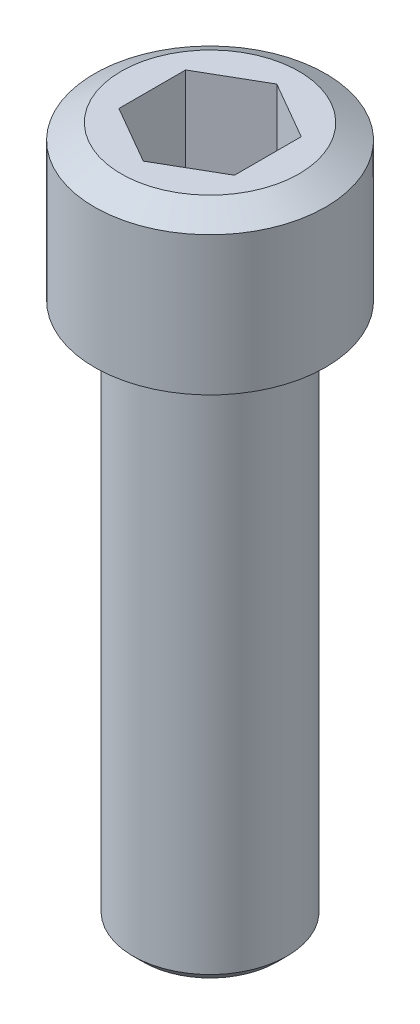
ISO-10303-21;
HEADER;
FILE_DESCRIPTION(('STEP AP214'),'2;1');
FILE_NAME('part.step','',(''),(''),'','','');
FILE_SCHEMA(('AUTOMOTIVE_DESIGN { 1 0 10303 214 1 1 1 1 }'));
ENDSEC;
DATA;
#1=APPLICATION_CONTEXT('core data for automotive mechanical design processes');
#2=APPLICATION_PROTOCOL_DEFINITION('international standard','automotive_design',2000,#1);
#3=PRODUCT_CONTEXT('',#1,'mechanical');
#4=PRODUCT('Part','Part','',(#3));
#5=PRODUCT_RELATED_PRODUCT_CATEGORY('part','',(#4));
#6=PRODUCT_DEFINITION_FORMATION('','',#4);
#7=PRODUCT_DEFINITION_CONTEXT('part definition',#1,'design');
#8=PRODUCT_DEFINITION('design','',#6,#7);
#9=PRODUCT_DEFINITION_SHAPE('','',#8);
#10=(LENGTH_UNIT() NAMED_UNIT(*) SI_UNIT(.MILLI.,.METRE.));
#11=(NAMED_UNIT(*) PLANE_ANGLE_UNIT() SI_UNIT($,.RADIAN.));
#12=(NAMED_UNIT(*) SI_UNIT($,.STERADIAN.) SOLID_ANGLE_UNIT());
#13=UNCERTAINTY_MEASURE_WITH_UNIT(LENGTH_MEASURE(1.E-05),#10,'distance_accuracy_value','');
#14=(GEOMETRIC_REPRESENTATION_CONTEXT(3) GLOBAL_UNCERTAINTY_ASSIGNED_CONTEXT((#13)) GLOBAL_UNIT_ASSIGNED_CONTEXT((#10,
#11,#12)) REPRESENTATION_CONTEXT('',''));
#15=CARTESIAN_POINT('',(0.,0.,0.));
#16=DIRECTION('',(0.,0.,1.));
#17=DIRECTION('',(1.,0.,0.));
#18=AXIS2_PLACEMENT_3D('',#15,#16,#17);
#19=CARTESIAN_POINT('',(0.,11.85,0.));
#20=DIRECTION('',(0.,1.,0.));
#21=DIRECTION('',(1.,0.,0.));
#22=AXIS2_PLACEMENT_3D('',#19,#20,#21);
#23=CYLINDRICAL_SURFACE('',#22,2.25);
#24=CARTESIAN_POINT('',(0.,13.2,0.));
#25=DIRECTION('',(0.,-1.,0.));
#26=DIRECTION('',(1.,0.,0.));
#27=AXIS2_PLACEMENT_3D('',#24,#25,#26);
#28=CIRCLE('',#27,2.25);
#29=CARTESIAN_POINT('',(2.25,13.2,0.));
#30=VERTEX_POINT('',#29);
#31=EDGE_CURVE('E11',#30,#30,#28,.T.);
#32=ORIENTED_EDGE('',*,*,#31,.T.);
#33=EDGE_LOOP('',(#32));
#34=FACE_BOUND('',#33,.T.);
#35=CARTESIAN_POINT('',(0.,10.5,0.));
#36=DIRECTION('',(0.,-1.,0.));
#37=DIRECTION('',(1.,0.,0.));
#38=AXIS2_PLACEMENT_3D('',#35,#36,#37);
#39=CIRCLE('',#38,2.25);
#40=CARTESIAN_POINT('',(2.25,10.5,0.));
#41=VERTEX_POINT('',#40);
#42=EDGE_CURVE('E155',#41,#41,#39,.T.);
#43=ORIENTED_EDGE('',*,*,#42,.F.);
#44=EDGE_LOOP('',(#43));
#45=FACE_BOUND('',#44,.T.);
#46=ADVANCED_FACE('F16',(#34,#45),#23,.T.);
#47=CARTESIAN_POINT('',(0.,13.35,0.));
#48=DIRECTION('',(0.,-1.,0.));
#49=DIRECTION('',(1.,0.,0.));
#50=AXIS2_PLACEMENT_3D('',#47,#48,#49);
#51=CONICAL_SURFACE('',#50,1.99019237886467,1.0471975511966);
#52=CARTESIAN_POINT('',(0.,13.5,0.));
#53=DIRECTION('',(0.,-1.,0.));
#54=DIRECTION('',(1.,0.,0.));
#55=AXIS2_PLACEMENT_3D('',#52,#53,#54);
#56=CIRCLE('',#55,1.73038475772933);
#57=CARTESIAN_POINT('',(1.73038475772933,13.5,0.));
#58=VERTEX_POINT('',#57);
#59=EDGE_CURVE('E29',#58,#58,#56,.T.);
#60=ORIENTED_EDGE('',*,*,#59,.T.);
#61=EDGE_LOOP('',(#60));
#62=FACE_BOUND('',#61,.T.);
#63=ORIENTED_EDGE('',*,*,#31,.F.);
#64=EDGE_LOOP('',(#63));
#65=FACE_BOUND('',#64,.T.);
#66=ADVANCED_FACE('F201',(#62,#65),#51,.T.);
#67=CARTESIAN_POINT('',(0.,11.0490381056767,0.));
#68=DIRECTION('',(0.,1.,0.));
#69=DIRECTION('',(1.,0.,0.));
#70=AXIS2_PLACEMENT_3D('',#67,#68,#69);
#71=CONICAL_SURFACE('',#70,0.75,1.30899693899575);
#72=CARTESIAN_POINT('',(0.,10.8480762113533,0.));
#73=VERTEX_POINT('',#72);
#74=VERTEX_LOOP('',#73);
#75=FACE_BOUND('',#74,.T.);
#76=CARTESIAN_POINT('',(0.,11.1961524227066,1.29903810567666));
#77=CARTESIAN_POINT('',(0.562500000000007,11.1091333698683,0.974278579257489));
#78=CARTESIAN_POINT('',(1.125,11.1961524227066,0.649519052838329));
#79=(BOUNDED_CURVE() B_SPLINE_CURVE(2,(#76,#77,#78),.UNSPECIFIED.,.F.,
.F.) B_SPLINE_CURVE_WITH_KNOTS((3,3),(0.0290267347377551,0.17041964108718),
.UNSPECIFIED.) CURVE() GEOMETRIC_REPRESENTATION_ITEM() RATIONAL_B_SPLINE_CURVE((1.08290376865476,
1.25042956467855,1.08290376865476)) REPRESENTATION_ITEM(''));
#80=CARTESIAN_POINT('',(0.,11.1961524227066,1.29903810567666));
#81=VERTEX_POINT('',#80);
#82=CARTESIAN_POINT('',(1.125,11.1961524227066,0.649519052838329));
#83=VERTEX_POINT('',#82);
#84=EDGE_CURVE('E116',#81,#83,#79,.T.);
#85=ORIENTED_EDGE('',*,*,#84,.T.);
#86=CARTESIAN_POINT('',(1.125,11.1961524227066,0.649519052838329));
#87=CARTESIAN_POINT('',(1.125,11.1091333698683,0.));
#88=CARTESIAN_POINT('',(1.125,11.1961524227066,-0.64951905283833));
#89=(BOUNDED_CURVE() B_SPLINE_CURVE(2,(#86,#87,#88),.UNSPECIFIED.,.F.,
.F.) B_SPLINE_CURVE_WITH_KNOTS((3,3),(0.0290267347377549,0.17041964108718),
.UNSPECIFIED.) CURVE() GEOMETRIC_REPRESENTATION_ITEM() RATIONAL_B_SPLINE_CURVE((1.08290376865476,
1.25042956467855,1.08290376865476)) REPRESENTATION_ITEM(''));
#90=CARTESIAN_POINT('',(1.125,11.1961524227066,-0.649519052838329));
#91=VERTEX_POINT('',#90);
#92=EDGE_CURVE('E135',#83,#91,#89,.T.);
#93=ORIENTED_EDGE('',*,*,#92,.T.);
#94=CARTESIAN_POINT('',(1.125,11.1961524227066,-0.649519052838329));
#95=CARTESIAN_POINT('',(0.562499999999995,11.1091333698683,-0.974278579257497));
#96=CARTESIAN_POINT('',(0.,11.1961524227066,-1.29903810567666));
#97=(BOUNDED_CURVE() B_SPLINE_CURVE(2,(#94,#95,#96),.UNSPECIFIED.,.F.,
.F.) B_SPLINE_CURVE_WITH_KNOTS((3,3),(0.0290267347377549,0.17041964108718),
.UNSPECIFIED.) CURVE() GEOMETRIC_REPRESENTATION_ITEM() RATIONAL_B_SPLINE_CURVE((1.08290376865476,
1.25042956467855,1.08290376865476)) REPRESENTATION_ITEM(''));
#98=CARTESIAN_POINT('',(0.,11.1961524227066,-1.29903810567666));
#99=VERTEX_POINT('',#98);
#100=EDGE_CURVE('E105',#91,#99,#97,.T.);
#101=ORIENTED_EDGE('',*,*,#100,.T.);
#102=CARTESIAN_POINT('',(0.,11.1961524227066,-1.29903810567666));
#103=CARTESIAN_POINT('',(-0.562500000000006,11.1091333698683,-0.974278579257492));
#104=CARTESIAN_POINT('',(-1.125,11.1961524227066,-0.649519052838329));
#105=(BOUNDED_CURVE() B_SPLINE_CURVE(2,(#102,#103,#104),.UNSPECIFIED.,.F.,
.F.) B_SPLINE_CURVE_WITH_KNOTS((3,3),(0.029026734737754,0.170419641087181),
.UNSPECIFIED.) CURVE() GEOMETRIC_REPRESENTATION_ITEM() RATIONAL_B_SPLINE_CURVE((1.08290376865478,
1.2504295646786,1.08290376865478)) REPRESENTATION_ITEM(''));
#106=CARTESIAN_POINT('',(-1.125,11.1961524227066,-0.649519052838329));
#107=VERTEX_POINT('',#106);
#108=EDGE_CURVE('E147',#99,#107,#105,.T.);
#109=ORIENTED_EDGE('',*,*,#108,.T.);
#110=CARTESIAN_POINT('',(-1.125,11.1961524227066,-0.64951905283833));
#111=CARTESIAN_POINT('',(-1.125,11.1091333698683,0.));
#112=CARTESIAN_POINT('',(-1.125,11.1961524227066,0.64951905283833));
#113=(BOUNDED_CURVE() B_SPLINE_CURVE(2,(#110,#111,#112),.UNSPECIFIED.,.F.,
.F.) B_SPLINE_CURVE_WITH_KNOTS((3,3),(0.0290267347377542,0.170419641087182),
.UNSPECIFIED.) CURVE() GEOMETRIC_REPRESENTATION_ITEM() RATIONAL_B_SPLINE_CURVE((1.08290376865478,
1.25042956467861,1.08290376865478)) REPRESENTATION_ITEM(''));
#114=CARTESIAN_POINT('',(-1.125,11.1961524227066,0.649519052838329));
#115=VERTEX_POINT('',#114);
#116=EDGE_CURVE('E99',#107,#115,#113,.T.);
#117=ORIENTED_EDGE('',*,*,#116,.T.);
#118=CARTESIAN_POINT('',(-1.125,11.1961524227066,0.649519052838329));
#119=CARTESIAN_POINT('',(-0.562499999999994,11.1091333698683,0.974278579257495));
#120=CARTESIAN_POINT('',(0.,11.1961524227066,1.29903810567666));
#121=(BOUNDED_CURVE() B_SPLINE_CURVE(2,(#118,#119,#120),.UNSPECIFIED.,.F.,
.F.) B_SPLINE_CURVE_WITH_KNOTS((3,3),(0.0290267347377543,0.170419641087182),
.UNSPECIFIED.) CURVE() GEOMETRIC_REPRESENTATION_ITEM() RATIONAL_B_SPLINE_CURVE((1.08290376865478,
1.25042956467861,1.08290376865478)) REPRESENTATION_ITEM(''));
#122=EDGE_CURVE('E20',#115,#81,#121,.T.);
#123=ORIENTED_EDGE('',*,*,#122,.T.);
#124=EDGE_LOOP('',(#85,#93,#101,#109,#117,#123));
#125=FACE_BOUND('',#124,.T.);
#126=ADVANCED_FACE('F191',(#75,#125),#71,.F.);
#127=CARTESIAN_POINT('',(0.,13.5,0.));
#128=DIRECTION('',(0.,-1.,0.));
#129=DIRECTION('',(0.,0.,-1.));
#130=AXIS2_PLACEMENT_3D('',#127,#128,#129);
#131=PLANE('',#130);
#132=DIRECTION('',(-0.866025403784439,0.,0.5));
#133=VECTOR('',#132,1.);
#134=CARTESIAN_POINT('',(0.28125,13.5,1.13665834246708));
#135=LINE('',#134,#133);
#136=CARTESIAN_POINT('',(1.125,13.5,0.649519052838329));
#137=VERTEX_POINT('',#136);
#138=CARTESIAN_POINT('',(0.,13.5,1.29903810567666));
#139=VERTEX_POINT('',#138);
#140=EDGE_CURVE('E82',#137,#139,#135,.T.);
#141=ORIENTED_EDGE('',*,*,#140,.T.);
#142=DIRECTION('',(-0.866025403784439,0.,-0.5));
#143=VECTOR('',#142,1.);
#144=CARTESIAN_POINT('',(-0.84375,13.5,0.811898816047911));
#145=LINE('',#144,#143);
#146=CARTESIAN_POINT('',(-1.125,13.5,0.649519052838329));
#147=VERTEX_POINT('',#146);
#148=EDGE_CURVE('E73',#139,#147,#145,.T.);
#149=ORIENTED_EDGE('',*,*,#148,.T.);
#150=DIRECTION('',(0.,0.,-1.));
#151=VECTOR('',#150,1.);
#152=CARTESIAN_POINT('',(-1.125,13.5,-0.324759526419165));
#153=LINE('',#152,#151);
#154=CARTESIAN_POINT('',(-1.125,13.5,-0.649519052838329));
#155=VERTEX_POINT('',#154);
#156=EDGE_CURVE('E79',#147,#155,#153,.T.);
#157=ORIENTED_EDGE('',*,*,#156,.T.);
#158=DIRECTION('',(0.866025403784439,0.,-0.5));
#159=VECTOR('',#158,1.);
#160=CARTESIAN_POINT('',(-0.28125,13.5,-1.13665834246708));
#161=LINE('',#160,#159);
#162=CARTESIAN_POINT('',(0.,13.5,-1.29903810567666));
#163=VERTEX_POINT('',#162);
#164=EDGE_CURVE('E145',#155,#163,#161,.T.);
#165=ORIENTED_EDGE('',*,*,#164,.T.);
#166=DIRECTION('',(0.866025403784439,0.,0.5));
#167=VECTOR('',#166,1.);
#168=CARTESIAN_POINT('',(0.84375,13.5,-0.811898816047912));
#169=LINE('',#168,#167);
#170=CARTESIAN_POINT('',(1.125,13.5,-0.649519052838329));
#171=VERTEX_POINT('',#170);
#172=EDGE_CURVE('E136',#163,#171,#169,.T.);
#173=ORIENTED_EDGE('',*,*,#172,.T.);
#174=DIRECTION('',(0.,0.,1.));
#175=VECTOR('',#174,1.);
#176=CARTESIAN_POINT('',(1.125,13.5,0.324759526419165));
#177=LINE('',#176,#175);
#178=EDGE_CURVE('E125',#171,#137,#177,.T.);
#179=ORIENTED_EDGE('',*,*,#178,.T.);
#180=EDGE_LOOP('',(#141,#149,#157,#165,#173,#179));
#181=FACE_BOUND('',#180,.T.);
#182=ORIENTED_EDGE('',*,*,#59,.F.);
#183=EDGE_LOOP('',(#182));
#184=FACE_BOUND('',#183,.T.);
#185=ADVANCED_FACE('F75',(#181,#184),#131,.F.);
#186=CARTESIAN_POINT('',(-1.125,13.5,0.649519052838329));
#187=DIRECTION('',(-0.5,0.,0.866025403784439));
#188=DIRECTION('',(0.866025403784439,0.,0.5));
#189=AXIS2_PLACEMENT_3D('',#186,#187,#188);
#190=PLANE('',#189);
#191=ORIENTED_EDGE('',*,*,#122,.F.);
#192=DIRECTION('',(0.,-1.,0.));
#193=VECTOR('',#192,1.);
#194=CARTESIAN_POINT('',(-1.125,13.5,0.649519052838329));
#195=LINE('',#194,#193);
#196=EDGE_CURVE('E88',#147,#115,#195,.T.);
#197=ORIENTED_EDGE('',*,*,#196,.F.);
#198=ORIENTED_EDGE('',*,*,#148,.F.);
#199=DIRECTION('',(0.,-1.,0.));
#200=VECTOR('',#199,1.);
#201=CARTESIAN_POINT('',(0.,13.5,1.29903810567666));
#202=LINE('',#201,#200);
#203=EDGE_CURVE('E124',#139,#81,#202,.T.);
#204=ORIENTED_EDGE('',*,*,#203,.T.);
#205=EDGE_LOOP('',(#191,#197,#198,#204));
#206=FACE_BOUND('',#205,.T.);
#207=ADVANCED_FACE('F89',(#206),#190,.F.);
#208=CARTESIAN_POINT('',(-1.125,13.5,-0.649519052838329));
#209=DIRECTION('',(-1.,0.,0.));
#210=DIRECTION('',(0.,0.,1.));
#211=AXIS2_PLACEMENT_3D('',#208,#209,#210);
#212=PLANE('',#211);
#213=ORIENTED_EDGE('',*,*,#116,.F.);
#214=DIRECTION('',(0.,-1.,0.));
#215=VECTOR('',#214,1.);
#216=CARTESIAN_POINT('',(-1.125,13.5,-0.649519052838329));
#217=LINE('',#216,#215);
#218=EDGE_CURVE('E97',#155,#107,#217,.T.);
#219=ORIENTED_EDGE('',*,*,#218,.F.);
#220=ORIENTED_EDGE('',*,*,#156,.F.);
#221=ORIENTED_EDGE('',*,*,#196,.T.);
#222=EDGE_LOOP('',(#213,#219,#220,#221));
#223=FACE_BOUND('',#222,.T.);
#224=ADVANCED_FACE('F95',(#223),#212,.F.);
#225=CARTESIAN_POINT('',(0.,13.5,-1.29903810567666));
#226=DIRECTION('',(-0.5,0.,-0.866025403784439));
#227=DIRECTION('',(-0.866025403784439,0.,0.5));
#228=AXIS2_PLACEMENT_3D('',#225,#226,#227);
#229=PLANE('',#228);
#230=ORIENTED_EDGE('',*,*,#108,.F.);
#231=DIRECTION('',(0.,-1.,0.));
#232=VECTOR('',#231,1.);
#233=CARTESIAN_POINT('',(0.,13.5,-1.29903810567666));
#234=LINE('',#233,#232);
#235=EDGE_CURVE('E131',#163,#99,#234,.T.);
#236=ORIENTED_EDGE('',*,*,#235,.F.);
#237=ORIENTED_EDGE('',*,*,#164,.F.);
#238=ORIENTED_EDGE('',*,*,#218,.T.);
#239=EDGE_LOOP('',(#230,#236,#237,#238));
#240=FACE_BOUND('',#239,.T.);
#241=ADVANCED_FACE('F242',(#240),#229,.F.);
#242=CARTESIAN_POINT('',(0.,13.5,1.29903810567666));
#243=DIRECTION('',(0.5,0.,0.866025403784439));
#244=DIRECTION('',(0.866025403784439,0.,-0.5));
#245=AXIS2_PLACEMENT_3D('',#242,#243,#244);
#246=PLANE('',#245);
#247=ORIENTED_EDGE('',*,*,#84,.F.);
#248=ORIENTED_EDGE('',*,*,#203,.F.);
#249=ORIENTED_EDGE('',*,*,#140,.F.);
#250=DIRECTION('',(0.,-1.,0.));
#251=VECTOR('',#250,1.);
#252=CARTESIAN_POINT('',(1.125,13.5,0.649519052838329));
#253=LINE('',#252,#251);
#254=EDGE_CURVE('E140',#137,#83,#253,.T.);
#255=ORIENTED_EDGE('',*,*,#254,.T.);
#256=EDGE_LOOP('',(#247,#248,#249,#255));
#257=FACE_BOUND('',#256,.T.);
#258=ADVANCED_FACE('F219',(#257),#246,.F.);
#259=CARTESIAN_POINT('',(1.125,13.5,0.649519052838329));
#260=DIRECTION('',(1.,0.,0.));
#261=DIRECTION('',(0.,0.,-1.));
#262=AXIS2_PLACEMENT_3D('',#259,#260,#261);
#263=PLANE('',#262);
#264=ORIENTED_EDGE('',*,*,#92,.F.);
#265=ORIENTED_EDGE('',*,*,#254,.F.);
#266=ORIENTED_EDGE('',*,*,#178,.F.);
#267=DIRECTION('',(0.,-1.,0.));
#268=VECTOR('',#267,1.);
#269=CARTESIAN_POINT('',(1.125,13.5,-0.649519052838329));
#270=LINE('',#269,#268);
#271=EDGE_CURVE('E104',#171,#91,#270,.T.);
#272=ORIENTED_EDGE('',*,*,#271,.T.);
#273=EDGE_LOOP('',(#264,#265,#266,#272));
#274=FACE_BOUND('',#273,.T.);
#275=ADVANCED_FACE('F183',(#274),#263,.F.);
#276=CARTESIAN_POINT('',(1.125,13.5,-0.649519052838329));
#277=DIRECTION('',(0.5,0.,-0.866025403784439));
#278=DIRECTION('',(-0.866025403784439,0.,-0.5));
#279=AXIS2_PLACEMENT_3D('',#276,#277,#278);
#280=PLANE('',#279);
#281=ORIENTED_EDGE('',*,*,#100,.F.);
#282=ORIENTED_EDGE('',*,*,#271,.F.);
#283=ORIENTED_EDGE('',*,*,#172,.F.);
#284=ORIENTED_EDGE('',*,*,#235,.T.);
#285=EDGE_LOOP('',(#281,#282,#283,#284));
#286=FACE_BOUND('',#285,.T.);
#287=ADVANCED_FACE('F188',(#286),#280,.F.);
#288=CARTESIAN_POINT('',(0.75,0.,0.));
#289=DIRECTION('',(0.,-1.,0.));
#290=DIRECTION('',(0.,0.,-1.));
#291=AXIS2_PLACEMENT_3D('',#288,#289,#290);
#292=PLANE('',#291);
#293=CARTESIAN_POINT('',(0.,0.,0.));
#294=DIRECTION('',(0.,1.,0.));
#295=DIRECTION('',(-1.,0.,0.));
#296=AXIS2_PLACEMENT_3D('',#293,#294,#295);
#297=CIRCLE('',#296,1.3);
#298=CARTESIAN_POINT('',(1.3,0.,0.));
#299=VERTEX_POINT('',#298);
#300=EDGE_CURVE('E109',#299,#299,#297,.T.);
#301=ORIENTED_EDGE('',*,*,#300,.F.);
#302=EDGE_LOOP('',(#301));
#303=FACE_BOUND('',#302,.T.);
#304=ADVANCED_FACE('F224',(#303),#292,.T.);
#305=CARTESIAN_POINT('',(0.,0.1,0.));
#306=DIRECTION('',(0.,1.,0.));
#307=DIRECTION('',(-1.,0.,0.));
#308=AXIS2_PLACEMENT_3D('',#305,#306,#307);
#309=CONICAL_SURFACE('',#308,1.4,0.785398163397446);
#310=ORIENTED_EDGE('',*,*,#300,.T.);
#311=EDGE_LOOP('',(#310));
#312=FACE_BOUND('',#311,.T.);
#313=CARTESIAN_POINT('',(0.,0.2,0.));
#314=DIRECTION('',(0.,-1.,0.));
#315=DIRECTION('',(-1.,0.,0.));
#316=AXIS2_PLACEMENT_3D('',#313,#314,#315);
#317=CIRCLE('',#316,1.5);
#318=CARTESIAN_POINT('',(1.5,0.2,0.));
#319=VERTEX_POINT('',#318);
#320=EDGE_CURVE('E149',#319,#319,#317,.T.);
#321=ORIENTED_EDGE('',*,*,#320,.T.);
#322=EDGE_LOOP('',(#321));
#323=FACE_BOUND('',#322,.T.);
#324=ADVANCED_FACE('F221',(#312,#323),#309,.T.);
#325=CARTESIAN_POINT('',(1.875,10.5,0.));
#326=DIRECTION('',(0.,-1.,0.));
#327=DIRECTION('',(0.,0.,-1.));
#328=AXIS2_PLACEMENT_3D('',#325,#326,#327);
#329=PLANE('',#328);
#330=CARTESIAN_POINT('',(0.,10.5,0.));
#331=DIRECTION('',(0.,-1.,0.));
#332=DIRECTION('',(-1.,0.,0.));
#333=AXIS2_PLACEMENT_3D('',#330,#331,#332);
#334=CIRCLE('',#333,1.6);
#335=CARTESIAN_POINT('',(1.6,10.5,0.));
#336=VERTEX_POINT('',#335);
#337=EDGE_CURVE('E137',#336,#336,#334,.T.);
#338=ORIENTED_EDGE('',*,*,#337,.F.);
#339=EDGE_LOOP('',(#338));
#340=FACE_BOUND('',#339,.T.);
#341=ORIENTED_EDGE('',*,*,#42,.T.);
#342=EDGE_LOOP('',(#341));
#343=FACE_BOUND('',#342,.T.);
#344=ADVANCED_FACE('F18',(#340,#343),#329,.T.);
#345=CARTESIAN_POINT('',(0.,5.25,0.));
#346=DIRECTION('',(0.,1.,0.));
#347=DIRECTION('',(1.,0.,0.));
#348=AXIS2_PLACEMENT_3D('',#345,#346,#347);
#349=CYLINDRICAL_SURFACE('',#348,1.5);
#350=CARTESIAN_POINT('',(0.,10.4,0.));
#351=DIRECTION('',(0.,1.,0.));
#352=DIRECTION('',(-1.,0.,0.));
#353=AXIS2_PLACEMENT_3D('',#350,#351,#352);
#354=CIRCLE('',#353,1.5);
#355=CARTESIAN_POINT('',(1.5,10.4,0.));
#356=VERTEX_POINT('',#355);
#357=EDGE_CURVE('E139',#356,#356,#354,.T.);
#358=ORIENTED_EDGE('',*,*,#357,.F.);
#359=EDGE_LOOP('',(#358));
#360=FACE_BOUND('',#359,.T.);
#361=ORIENTED_EDGE('',*,*,#320,.F.);
#362=EDGE_LOOP('',(#361));
#363=FACE_BOUND('',#362,.T.);
#364=ADVANCED_FACE('F231',(#360,#363),#349,.T.);
#365=CARTESIAN_POINT('',(0.,10.4,0.));
#366=DIRECTION('',(0.,-1.,0.));
#367=DIRECTION('',(0.,0.,-1.));
#368=AXIS2_PLACEMENT_3D('',#365,#366,#367);
#369=TOROIDAL_SURFACE('',#368,1.6,0.1);
#370=ORIENTED_EDGE('',*,*,#357,.T.);
#371=EDGE_LOOP('',(#370));
#372=FACE_BOUND('',#371,.T.);
#373=ORIENTED_EDGE('',*,*,#337,.T.);
#374=EDGE_LOOP('',(#373));
#375=FACE_BOUND('',#374,.T.);
#376=ADVANCED_FACE('F228',(#372,#375),#369,.F.);
#377=CLOSED_SHELL('',(#46,#66,#126,#185,#207,#224,#241,#258,#275,#287,#304,#324,#344,#364,#376));
#378=MANIFOLD_SOLID_BREP('B1',#377);
#379=ADVANCED_BREP_SHAPE_REPRESENTATION('',(#18,#378),#14);
#380=SHAPE_DEFINITION_REPRESENTATION(#9,#379);
ENDSEC;
END-ISO-10303-21;
